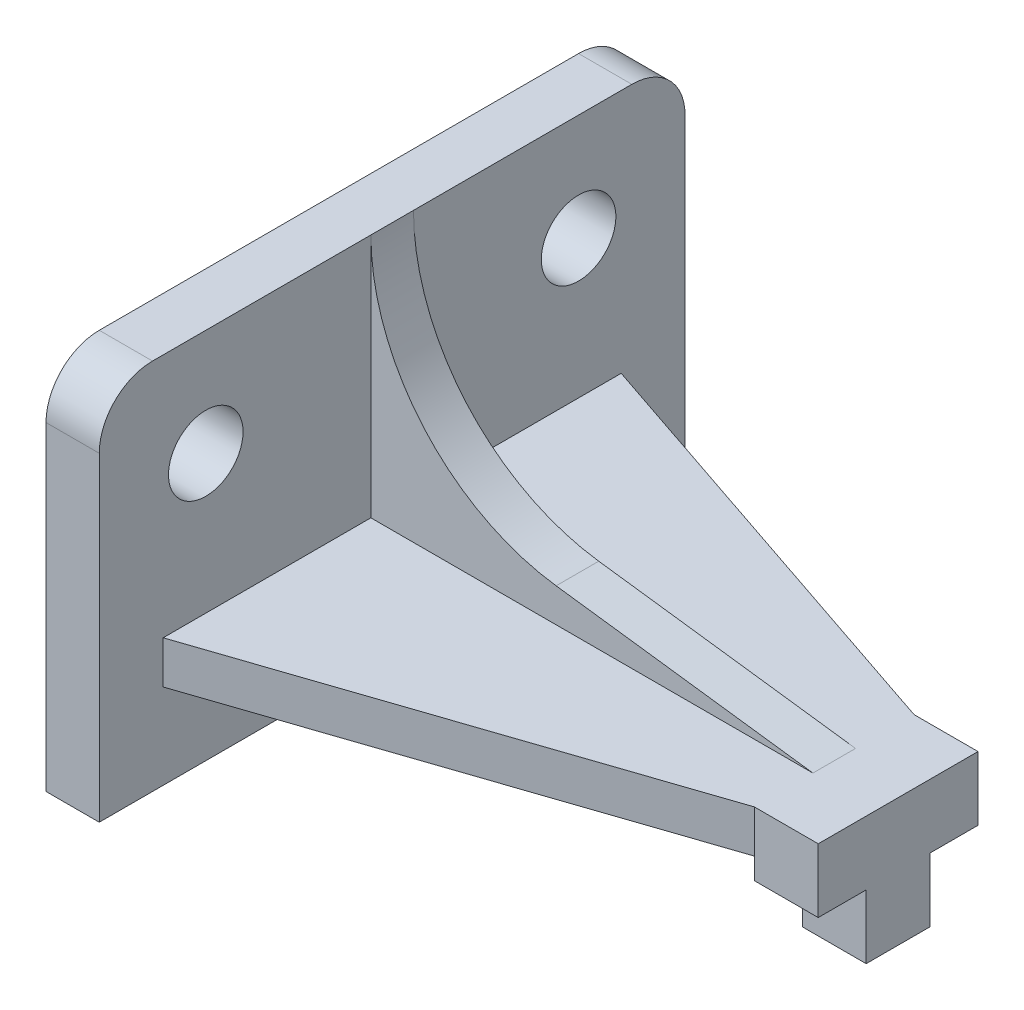
ISO-10303-21;
HEADER;
FILE_DESCRIPTION(('STEP AP214'),'2;1');
FILE_NAME('part.step','',(''),(''),'','','');
FILE_SCHEMA(('AUTOMOTIVE_DESIGN { 1 0 10303 214 1 1 1 1 }'));
ENDSEC;
DATA;
#1=APPLICATION_CONTEXT('core data for automotive mechanical design processes');
#2=APPLICATION_PROTOCOL_DEFINITION('international standard','automotive_design',2000,#1);
#3=PRODUCT_CONTEXT('',#1,'mechanical');
#4=PRODUCT('Part','Part','',(#3));
#5=PRODUCT_RELATED_PRODUCT_CATEGORY('part','',(#4));
#6=PRODUCT_DEFINITION_FORMATION('','',#4);
#7=PRODUCT_DEFINITION_CONTEXT('part definition',#1,'design');
#8=PRODUCT_DEFINITION('design','',#6,#7);
#9=PRODUCT_DEFINITION_SHAPE('','',#8);
#10=(LENGTH_UNIT() NAMED_UNIT(*) SI_UNIT(.MILLI.,.METRE.));
#11=(NAMED_UNIT(*) PLANE_ANGLE_UNIT() SI_UNIT($,.RADIAN.));
#12=(NAMED_UNIT(*) SI_UNIT($,.STERADIAN.) SOLID_ANGLE_UNIT());
#13=UNCERTAINTY_MEASURE_WITH_UNIT(LENGTH_MEASURE(1.E-05),#10,'distance_accuracy_value','');
#14=(GEOMETRIC_REPRESENTATION_CONTEXT(3) GLOBAL_UNCERTAINTY_ASSIGNED_CONTEXT((#13)) GLOBAL_UNIT_ASSIGNED_CONTEXT((#10,
#11,#12)) REPRESENTATION_CONTEXT('',''));
#15=CARTESIAN_POINT('',(0.,0.,0.));
#16=DIRECTION('',(0.,0.,1.));
#17=DIRECTION('',(1.,0.,0.));
#18=AXIS2_PLACEMENT_3D('',#15,#16,#17);
#19=CARTESIAN_POINT('',(93.,0.,0.));
#20=DIRECTION('',(-1.,0.,0.));
#21=DIRECTION('',(0.,0.,1.));
#22=AXIS2_PLACEMENT_3D('',#19,#20,#21);
#23=PLANE('',#22);
#24=DIRECTION('',(0.,1.,0.));
#25=VECTOR('',#24,1.);
#26=CARTESIAN_POINT('',(93.,-23.,15.));
#27=LINE('',#26,#25);
#28=CARTESIAN_POINT('',(93.,-23.,15.));
#29=VERTEX_POINT('',#28);
#30=CARTESIAN_POINT('',(93.,-19.,15.));
#31=VERTEX_POINT('',#30);
#32=EDGE_CURVE('E222',#29,#31,#27,.T.);
#33=ORIENTED_EDGE('',*,*,#32,.T.);
#34=DIRECTION('',(0.,0.,-1.));
#35=VECTOR('',#34,1.);
#36=CARTESIAN_POINT('',(93.,-19.,4.));
#37=LINE('',#36,#35);
#38=CARTESIAN_POINT('',(93.,-19.,-15.));
#39=VERTEX_POINT('',#38);
#40=EDGE_CURVE('E197',#31,#39,#37,.T.);
#41=ORIENTED_EDGE('',*,*,#40,.T.);
#42=DIRECTION('',(0.,-1.,0.));
#43=VECTOR('',#42,1.);
#44=CARTESIAN_POINT('',(93.,-11.,-15.));
#45=LINE('',#44,#43);
#46=CARTESIAN_POINT('',(93.,-23.,-15.));
#47=VERTEX_POINT('',#46);
#48=EDGE_CURVE('E214',#39,#47,#45,.T.);
#49=ORIENTED_EDGE('',*,*,#48,.T.);
#50=DIRECTION('',(0.,0.,1.));
#51=VECTOR('',#50,1.);
#52=CARTESIAN_POINT('',(93.,-23.,-15.));
#53=LINE('',#52,#51);
#54=CARTESIAN_POINT('',(93.,-23.,-6.));
#55=VERTEX_POINT('',#54);
#56=EDGE_CURVE('E216',#47,#55,#53,.T.);
#57=ORIENTED_EDGE('',*,*,#56,.T.);
#58=DIRECTION('',(0.,-1.,0.));
#59=VECTOR('',#58,1.);
#60=CARTESIAN_POINT('',(93.,-23.,-6.));
#61=LINE('',#60,#59);
#62=CARTESIAN_POINT('',(93.,-35.,-6.));
#63=VERTEX_POINT('',#62);
#64=EDGE_CURVE('E220',#55,#63,#61,.T.);
#65=ORIENTED_EDGE('',*,*,#64,.T.);
#66=DIRECTION('',(0.,0.,1.));
#67=VECTOR('',#66,1.);
#68=CARTESIAN_POINT('',(93.,-35.,-6.));
#69=LINE('',#68,#67);
#70=CARTESIAN_POINT('',(93.,-35.,6.00000000000001));
#71=VERTEX_POINT('',#70);
#72=EDGE_CURVE('E254',#63,#71,#69,.T.);
#73=ORIENTED_EDGE('',*,*,#72,.T.);
#74=DIRECTION('',(0.,1.,0.));
#75=VECTOR('',#74,1.);
#76=CARTESIAN_POINT('',(93.,-35.,6.00000000000001));
#77=LINE('',#76,#75);
#78=CARTESIAN_POINT('',(93.,-23.,6.00000000000001));
#79=VERTEX_POINT('',#78);
#80=EDGE_CURVE('E678',#71,#79,#77,.T.);
#81=ORIENTED_EDGE('',*,*,#80,.T.);
#82=DIRECTION('',(0.,0.,1.));
#83=VECTOR('',#82,1.);
#84=CARTESIAN_POINT('',(93.,-23.,6.00000000000001));
#85=LINE('',#84,#83);
#86=EDGE_CURVE('E680',#79,#29,#85,.T.);
#87=ORIENTED_EDGE('',*,*,#86,.T.);
#88=EDGE_LOOP('',(#33,#41,#49,#57,#65,#73,#81,#87));
#89=FACE_BOUND('',#88,.T.);
#90=ADVANCED_FACE('F45',(#89),#23,.T.);
#91=CARTESIAN_POINT('',(10.,25.,45.));
#92=DIRECTION('',(1.,0.,0.));
#93=DIRECTION('',(0.,0.,-1.));
#94=AXIS2_PLACEMENT_3D('',#91,#92,#93);
#95=PLANE('',#94);
#96=DIRECTION('',(0.,0.,1.));
#97=VECTOR('',#96,1.);
#98=CARTESIAN_POINT('',(9.99999999999999,-11.,4.));
#99=LINE('',#98,#97);
#100=CARTESIAN_POINT('',(9.99999999999999,-11.,-43.));
#101=VERTEX_POINT('',#100);
#102=CARTESIAN_POINT('',(9.99999999999999,-11.,-4.));
#103=VERTEX_POINT('',#102);
#104=EDGE_CURVE('E426',#101,#103,#99,.T.);
#105=ORIENTED_EDGE('',*,*,#104,.F.);
#106=DIRECTION('',(0.,-1.,0.));
#107=VECTOR('',#106,1.);
#108=CARTESIAN_POINT('',(9.99999999999999,-11.,-43.));
#109=LINE('',#108,#107);
#110=CARTESIAN_POINT('',(9.99999999999999,-19.,-43.));
#111=VERTEX_POINT('',#110);
#112=EDGE_CURVE('E192',#101,#111,#109,.T.);
#113=ORIENTED_EDGE('',*,*,#112,.T.);
#114=DIRECTION('',(0.,0.,1.));
#115=VECTOR('',#114,1.);
#116=CARTESIAN_POINT('',(9.99999999999999,-19.,4.));
#117=LINE('',#116,#115);
#118=CARTESIAN_POINT('',(9.99999999999998,-19.,43.));
#119=VERTEX_POINT('',#118);
#120=EDGE_CURVE('E650',#111,#119,#117,.T.);
#121=ORIENTED_EDGE('',*,*,#120,.T.);
#122=DIRECTION('',(0.,-1.,0.));
#123=VECTOR('',#122,1.);
#124=CARTESIAN_POINT('',(9.99999999999998,-11.,43.));
#125=LINE('',#124,#123);
#126=CARTESIAN_POINT('',(9.99999999999998,-11.,43.));
#127=VERTEX_POINT('',#126);
#128=EDGE_CURVE('E665',#127,#119,#125,.T.);
#129=ORIENTED_EDGE('',*,*,#128,.F.);
#130=CARTESIAN_POINT('',(9.99999999999999,-11.,4.));
#131=VERTEX_POINT('',#130);
#132=EDGE_CURVE('E196',#131,#127,#99,.T.);
#133=ORIENTED_EDGE('',*,*,#132,.F.);
#134=DIRECTION('',(0.,-1.,0.));
#135=VECTOR('',#134,1.);
#136=CARTESIAN_POINT('',(10.,35.,4.));
#137=LINE('',#136,#135);
#138=CARTESIAN_POINT('',(10.,35.,4.));
#139=VERTEX_POINT('',#138);
#140=EDGE_CURVE('E284',#139,#131,#137,.T.);
#141=ORIENTED_EDGE('',*,*,#140,.F.);
#142=DIRECTION('',(0.,0.,1.));
#143=VECTOR('',#142,1.);
#144=CARTESIAN_POINT('',(10.,35.,44.9999999999999));
#145=LINE('',#144,#143);
#146=CARTESIAN_POINT('',(10.,35.,44.9999999999999));
#147=VERTEX_POINT('',#146);
#148=EDGE_CURVE('E336',#139,#147,#145,.T.);
#149=ORIENTED_EDGE('',*,*,#148,.T.);
#150=CARTESIAN_POINT('',(10.,25.,45.));
#151=DIRECTION('',(1.,0.,0.));
#152=DIRECTION('',(0.,0.,-1.));
#153=AXIS2_PLACEMENT_3D('',#150,#151,#152);
#154=CIRCLE('',#153,10.);
#155=CARTESIAN_POINT('',(10.,24.9999999999999,55.));
#156=VERTEX_POINT('',#155);
#157=EDGE_CURVE('E340',#147,#156,#154,.T.);
#158=ORIENTED_EDGE('',*,*,#157,.T.);
#159=DIRECTION('',(0.,-1.,0.));
#160=VECTOR('',#159,1.);
#161=CARTESIAN_POINT('',(10.,24.9999999999999,55.));
#162=LINE('',#161,#160);
#163=CARTESIAN_POINT('',(10.,-35.,55.));
#164=VERTEX_POINT('',#163);
#165=EDGE_CURVE('E343',#156,#164,#162,.T.);
#166=ORIENTED_EDGE('',*,*,#165,.T.);
#167=DIRECTION('',(0.,0.,-1.));
#168=VECTOR('',#167,1.);
#169=CARTESIAN_POINT('',(10.,-35.,55.));
#170=LINE('',#169,#168);
#171=CARTESIAN_POINT('',(10.,-35.,-55.));
#172=VERTEX_POINT('',#171);
#173=EDGE_CURVE('E346',#164,#172,#170,.T.);
#174=ORIENTED_EDGE('',*,*,#173,.T.);
#175=DIRECTION('',(0.,1.,0.));
#176=VECTOR('',#175,1.);
#177=CARTESIAN_POINT('',(10.,24.9999999999999,-55.));
#178=LINE('',#177,#176);
#179=CARTESIAN_POINT('',(10.,24.9999999999999,-55.));
#180=VERTEX_POINT('',#179);
#181=EDGE_CURVE('E328',#172,#180,#178,.T.);
#182=ORIENTED_EDGE('',*,*,#181,.T.);
#183=CARTESIAN_POINT('',(10.,25.,-45.));
#184=DIRECTION('',(1.,0.,0.));
#185=DIRECTION('',(0.,0.,1.));
#186=AXIS2_PLACEMENT_3D('',#183,#184,#185);
#187=CIRCLE('',#186,10.);
#188=CARTESIAN_POINT('',(10.,35.,-44.9999999999999));
#189=VERTEX_POINT('',#188);
#190=EDGE_CURVE('E332',#180,#189,#187,.T.);
#191=ORIENTED_EDGE('',*,*,#190,.T.);
#192=CARTESIAN_POINT('',(10.,35.,-4.));
#193=VERTEX_POINT('',#192);
#194=EDGE_CURVE('E337',#189,#193,#145,.T.);
#195=ORIENTED_EDGE('',*,*,#194,.T.);
#196=DIRECTION('',(0.,-1.,0.));
#197=VECTOR('',#196,1.);
#198=CARTESIAN_POINT('',(10.,35.,-4.));
#199=LINE('',#198,#197);
#200=EDGE_CURVE('E296',#193,#103,#199,.T.);
#201=ORIENTED_EDGE('',*,*,#200,.T.);
#202=EDGE_LOOP('',(#105,#113,#121,#129,#133,#141,#149,#158,#166,#174,#182,#191,#195,#201));
#203=FACE_BOUND('',#202,.T.);
#204=CARTESIAN_POINT('',(10.,15.,35.));
#205=DIRECTION('',(1.,0.,0.));
#206=DIRECTION('',(0.,0.,-1.));
#207=AXIS2_PLACEMENT_3D('',#204,#205,#206);
#208=CIRCLE('',#207,7.);
#209=CARTESIAN_POINT('',(10.,15.,28.));
#210=VERTEX_POINT('',#209);
#211=EDGE_CURVE('E320',#210,#210,#208,.T.);
#212=ORIENTED_EDGE('',*,*,#211,.F.);
#213=EDGE_LOOP('',(#212));
#214=FACE_BOUND('',#213,.T.);
#215=CARTESIAN_POINT('',(10.,15.,-35.));
#216=DIRECTION('',(1.,0.,0.));
#217=DIRECTION('',(0.,0.,1.));
#218=AXIS2_PLACEMENT_3D('',#215,#216,#217);
#219=CIRCLE('',#218,7.);
#220=CARTESIAN_POINT('',(10.,15.,-28.));
#221=VERTEX_POINT('',#220);
#222=EDGE_CURVE('E312',#221,#221,#219,.T.);
#223=ORIENTED_EDGE('',*,*,#222,.F.);
#224=EDGE_LOOP('',(#223));
#225=FACE_BOUND('',#224,.T.);
#226=ADVANCED_FACE('F405',(#203,#214,#225),#95,.T.);
#227=CARTESIAN_POINT('',(0.,25.,45.));
#228=DIRECTION('',(1.,0.,0.));
#229=DIRECTION('',(0.,0.,-1.));
#230=AXIS2_PLACEMENT_3D('',#227,#228,#229);
#231=PLANE('',#230);
#232=DIRECTION('',(0.,1.,0.));
#233=VECTOR('',#232,1.);
#234=CARTESIAN_POINT('',(0.,24.9999999999999,-55.));
#235=LINE('',#234,#233);
#236=CARTESIAN_POINT('',(0.,-35.,-55.));
#237=VERTEX_POINT('',#236);
#238=CARTESIAN_POINT('',(0.,24.9999999999999,-55.));
#239=VERTEX_POINT('',#238);
#240=EDGE_CURVE('E324',#237,#239,#235,.T.);
#241=ORIENTED_EDGE('',*,*,#240,.F.);
#242=DIRECTION('',(0.,0.,-1.));
#243=VECTOR('',#242,1.);
#244=CARTESIAN_POINT('',(0.,-35.,55.));
#245=LINE('',#244,#243);
#246=CARTESIAN_POINT('',(0.,-35.,55.));
#247=VERTEX_POINT('',#246);
#248=EDGE_CURVE('E333',#247,#237,#245,.T.);
#249=ORIENTED_EDGE('',*,*,#248,.F.);
#250=DIRECTION('',(0.,-1.,0.));
#251=VECTOR('',#250,1.);
#252=CARTESIAN_POINT('',(0.,24.9999999999999,55.));
#253=LINE('',#252,#251);
#254=CARTESIAN_POINT('',(0.,24.9999999999999,55.));
#255=VERTEX_POINT('',#254);
#256=EDGE_CURVE('E362',#255,#247,#253,.T.);
#257=ORIENTED_EDGE('',*,*,#256,.F.);
#258=CARTESIAN_POINT('',(0.,25.,45.));
#259=DIRECTION('',(1.,0.,0.));
#260=DIRECTION('',(0.,0.,-1.));
#261=AXIS2_PLACEMENT_3D('',#258,#259,#260);
#262=CIRCLE('',#261,10.);
#263=CARTESIAN_POINT('',(0.,35.,44.9999999999999));
#264=VERTEX_POINT('',#263);
#265=EDGE_CURVE('E359',#264,#255,#262,.T.);
#266=ORIENTED_EDGE('',*,*,#265,.F.);
#267=DIRECTION('',(0.,0.,1.));
#268=VECTOR('',#267,1.);
#269=CARTESIAN_POINT('',(0.,35.,44.9999999999999));
#270=LINE('',#269,#268);
#271=CARTESIAN_POINT('',(0.,35.,-44.9999999999999));
#272=VERTEX_POINT('',#271);
#273=EDGE_CURVE('E356',#272,#264,#270,.T.);
#274=ORIENTED_EDGE('',*,*,#273,.F.);
#275=CARTESIAN_POINT('',(0.,25.,-45.));
#276=DIRECTION('',(1.,0.,0.));
#277=DIRECTION('',(0.,0.,1.));
#278=AXIS2_PLACEMENT_3D('',#275,#276,#277);
#279=CIRCLE('',#278,10.);
#280=EDGE_CURVE('E353',#239,#272,#279,.T.);
#281=ORIENTED_EDGE('',*,*,#280,.F.);
#282=EDGE_LOOP('',(#241,#249,#257,#266,#274,#281));
#283=FACE_BOUND('',#282,.T.);
#284=CARTESIAN_POINT('',(0.,15.,35.));
#285=DIRECTION('',(1.,0.,0.));
#286=DIRECTION('',(0.,0.,-1.));
#287=AXIS2_PLACEMENT_3D('',#284,#285,#286);
#288=CIRCLE('',#287,7.);
#289=CARTESIAN_POINT('',(0.,15.,28.));
#290=VERTEX_POINT('',#289);
#291=EDGE_CURVE('E316',#290,#290,#288,.T.);
#292=ORIENTED_EDGE('',*,*,#291,.T.);
#293=EDGE_LOOP('',(#292));
#294=FACE_BOUND('',#293,.T.);
#295=CARTESIAN_POINT('',(0.,15.,-35.));
#296=DIRECTION('',(1.,0.,0.));
#297=DIRECTION('',(0.,0.,1.));
#298=AXIS2_PLACEMENT_3D('',#295,#296,#297);
#299=CIRCLE('',#298,7.);
#300=CARTESIAN_POINT('',(0.,15.,-28.));
#301=VERTEX_POINT('',#300);
#302=EDGE_CURVE('E311',#301,#301,#299,.T.);
#303=ORIENTED_EDGE('',*,*,#302,.T.);
#304=EDGE_LOOP('',(#303));
#305=FACE_BOUND('',#304,.T.);
#306=ADVANCED_FACE('F391',(#283,#294,#305),#231,.F.);
#307=CARTESIAN_POINT('',(10.,24.9999999999999,-55.));
#308=DIRECTION('',(0.,0.,1.));
#309=DIRECTION('',(0.,-1.,0.));
#310=AXIS2_PLACEMENT_3D('',#307,#308,#309);
#311=PLANE('',#310);
#312=ORIENTED_EDGE('',*,*,#240,.T.);
#313=DIRECTION('',(-1.,0.,0.));
#314=VECTOR('',#313,1.);
#315=CARTESIAN_POINT('',(10.,24.9999999999999,-55.));
#316=LINE('',#315,#314);
#317=EDGE_CURVE('E11',#180,#239,#316,.T.);
#318=ORIENTED_EDGE('',*,*,#317,.F.);
#319=ORIENTED_EDGE('',*,*,#181,.F.);
#320=DIRECTION('',(-1.,0.,0.));
#321=VECTOR('',#320,1.);
#322=CARTESIAN_POINT('',(10.,-35.,-55.));
#323=LINE('',#322,#321);
#324=EDGE_CURVE('E349',#172,#237,#323,.T.);
#325=ORIENTED_EDGE('',*,*,#324,.T.);
#326=EDGE_LOOP('',(#312,#318,#319,#325));
#327=FACE_BOUND('',#326,.T.);
#328=ADVANCED_FACE('F47',(#327),#311,.F.);
#329=CARTESIAN_POINT('',(10.,25.,-45.));
#330=DIRECTION('',(-1.,0.,0.));
#331=DIRECTION('',(0.,0.,1.));
#332=AXIS2_PLACEMENT_3D('',#329,#330,#331);
#333=CYLINDRICAL_SURFACE('',#332,10.);
#334=ORIENTED_EDGE('',*,*,#280,.T.);
#335=DIRECTION('',(-1.,0.,0.));
#336=VECTOR('',#335,1.);
#337=CARTESIAN_POINT('',(10.,35.,-44.9999999999999));
#338=LINE('',#337,#336);
#339=EDGE_CURVE('E54',#189,#272,#338,.T.);
#340=ORIENTED_EDGE('',*,*,#339,.F.);
#341=ORIENTED_EDGE('',*,*,#190,.F.);
#342=ORIENTED_EDGE('',*,*,#317,.T.);
#343=EDGE_LOOP('',(#334,#340,#341,#342));
#344=FACE_BOUND('',#343,.T.);
#345=ADVANCED_FACE('F429',(#344),#333,.T.);
#346=CARTESIAN_POINT('',(10.,35.,44.9999999999999));
#347=DIRECTION('',(0.,-1.,0.));
#348=DIRECTION('',(0.,0.,-1.));
#349=AXIS2_PLACEMENT_3D('',#346,#347,#348);
#350=PLANE('',#349);
#351=ORIENTED_EDGE('',*,*,#273,.T.);
#352=DIRECTION('',(-1.,0.,0.));
#353=VECTOR('',#352,1.);
#354=CARTESIAN_POINT('',(10.,35.,44.9999999999999));
#355=LINE('',#354,#353);
#356=EDGE_CURVE('E378',#147,#264,#355,.T.);
#357=ORIENTED_EDGE('',*,*,#356,.F.);
#358=ORIENTED_EDGE('',*,*,#148,.F.);
#359=DIRECTION('',(0.,0.,-1.));
#360=VECTOR('',#359,1.);
#361=CARTESIAN_POINT('',(10.,35.,4.));
#362=LINE('',#361,#360);
#363=EDGE_CURVE('E69',#139,#193,#362,.T.);
#364=ORIENTED_EDGE('',*,*,#363,.T.);
#365=ORIENTED_EDGE('',*,*,#194,.F.);
#366=ORIENTED_EDGE('',*,*,#339,.T.);
#367=EDGE_LOOP('',(#351,#357,#358,#364,#365,#366));
#368=FACE_BOUND('',#367,.T.);
#369=ADVANCED_FACE('F385',(#368),#350,.F.);
#370=CARTESIAN_POINT('',(10.,25.,45.));
#371=DIRECTION('',(-1.,0.,0.));
#372=DIRECTION('',(0.,0.,1.));
#373=AXIS2_PLACEMENT_3D('',#370,#371,#372);
#374=CYLINDRICAL_SURFACE('',#373,10.);
#375=ORIENTED_EDGE('',*,*,#265,.T.);
#376=DIRECTION('',(-1.,0.,0.));
#377=VECTOR('',#376,1.);
#378=CARTESIAN_POINT('',(10.,24.9999999999999,55.));
#379=LINE('',#378,#377);
#380=EDGE_CURVE('E374',#156,#255,#379,.T.);
#381=ORIENTED_EDGE('',*,*,#380,.F.);
#382=ORIENTED_EDGE('',*,*,#157,.F.);
#383=ORIENTED_EDGE('',*,*,#356,.T.);
#384=EDGE_LOOP('',(#375,#381,#382,#383));
#385=FACE_BOUND('',#384,.T.);
#386=ADVANCED_FACE('F397',(#385),#374,.T.);
#387=CARTESIAN_POINT('',(10.,24.9999999999999,55.));
#388=DIRECTION('',(0.,0.,-1.));
#389=DIRECTION('',(0.,1.,0.));
#390=AXIS2_PLACEMENT_3D('',#387,#388,#389);
#391=PLANE('',#390);
#392=ORIENTED_EDGE('',*,*,#256,.T.);
#393=DIRECTION('',(-1.,0.,0.));
#394=VECTOR('',#393,1.);
#395=CARTESIAN_POINT('',(10.,-35.,55.));
#396=LINE('',#395,#394);
#397=EDGE_CURVE('E370',#164,#247,#396,.T.);
#398=ORIENTED_EDGE('',*,*,#397,.F.);
#399=ORIENTED_EDGE('',*,*,#165,.F.);
#400=ORIENTED_EDGE('',*,*,#380,.T.);
#401=EDGE_LOOP('',(#392,#398,#399,#400));
#402=FACE_BOUND('',#401,.T.);
#403=ADVANCED_FACE('F401',(#402),#391,.F.);
#404=CARTESIAN_POINT('',(10.,-35.,55.));
#405=DIRECTION('',(0.,1.,0.));
#406=DIRECTION('',(0.,0.,1.));
#407=AXIS2_PLACEMENT_3D('',#404,#405,#406);
#408=PLANE('',#407);
#409=ORIENTED_EDGE('',*,*,#248,.T.);
#410=ORIENTED_EDGE('',*,*,#324,.F.);
#411=ORIENTED_EDGE('',*,*,#173,.F.);
#412=ORIENTED_EDGE('',*,*,#397,.T.);
#413=EDGE_LOOP('',(#409,#410,#411,#412));
#414=FACE_BOUND('',#413,.T.);
#415=ADVANCED_FACE('F432',(#414),#408,.F.);
#416=CARTESIAN_POINT('',(10.,15.,35.));
#417=DIRECTION('',(-1.,0.,0.));
#418=DIRECTION('',(0.,0.,1.));
#419=AXIS2_PLACEMENT_3D('',#416,#417,#418);
#420=CYLINDRICAL_SURFACE('',#419,7.);
#421=ORIENTED_EDGE('',*,*,#211,.T.);
#422=EDGE_LOOP('',(#421));
#423=FACE_BOUND('',#422,.T.);
#424=ORIENTED_EDGE('',*,*,#291,.F.);
#425=EDGE_LOOP('',(#424));
#426=FACE_BOUND('',#425,.T.);
#427=ADVANCED_FACE('F434',(#423,#426),#420,.F.);
#428=CARTESIAN_POINT('',(10.,15.,-35.));
#429=DIRECTION('',(-1.,0.,0.));
#430=DIRECTION('',(0.,0.,1.));
#431=AXIS2_PLACEMENT_3D('',#428,#429,#430);
#432=CYLINDRICAL_SURFACE('',#431,7.);
#433=ORIENTED_EDGE('',*,*,#222,.T.);
#434=EDGE_LOOP('',(#433));
#435=FACE_BOUND('',#434,.T.);
#436=ORIENTED_EDGE('',*,*,#302,.F.);
#437=EDGE_LOOP('',(#436));
#438=FACE_BOUND('',#437,.T.);
#439=ADVANCED_FACE('F440',(#435,#438),#432,.F.);
#440=CARTESIAN_POINT('',(50.,35.,4.));
#441=DIRECTION('',(0.,0.,-1.));
#442=DIRECTION('',(-1.,0.,0.));
#443=AXIS2_PLACEMENT_3D('',#440,#441,#442);
#444=CYLINDRICAL_SURFACE('',#443,40.);
#445=CARTESIAN_POINT('',(50.,35.,-4.));
#446=DIRECTION('',(0.,0.,-1.));
#447=DIRECTION('',(1.,0.,0.));
#448=AXIS2_PLACEMENT_3D('',#445,#446,#447);
#449=CIRCLE('',#448,40.);
#450=CARTESIAN_POINT('',(44.7839775989411,-4.65845572272894,-4.));
#451=VERTEX_POINT('',#450);
#452=EDGE_CURVE('E279',#451,#193,#449,.T.);
#453=ORIENTED_EDGE('',*,*,#452,.T.);
#454=ORIENTED_EDGE('',*,*,#363,.F.);
#455=CARTESIAN_POINT('',(50.,35.,4.));
#456=DIRECTION('',(0.,0.,-1.));
#457=DIRECTION('',(1.,0.,0.));
#458=AXIS2_PLACEMENT_3D('',#455,#456,#457);
#459=CIRCLE('',#458,40.);
#460=CARTESIAN_POINT('',(44.7839775989411,-4.65845572272894,4.));
#461=VERTEX_POINT('',#460);
#462=EDGE_CURVE('E280',#461,#139,#459,.T.);
#463=ORIENTED_EDGE('',*,*,#462,.F.);
#464=DIRECTION('',(0.,0.,-1.));
#465=VECTOR('',#464,1.);
#466=CARTESIAN_POINT('',(44.7839775989411,-4.65845572272894,4.));
#467=LINE('',#466,#465);
#468=EDGE_CURVE('E292',#461,#451,#467,.T.);
#469=ORIENTED_EDGE('',*,*,#468,.T.);
#470=EDGE_LOOP('',(#453,#454,#463,#469));
#471=FACE_BOUND('',#470,.T.);
#472=ADVANCED_FACE('F418',(#471),#444,.F.);
#473=CARTESIAN_POINT('',(44.7839775989411,-4.65845572272894,4.));
#474=DIRECTION('',(-0.130400560026472,-0.991461393068223,0.));
#475=DIRECTION('',(0.991461393068224,-0.130400560026472,0.));
#476=AXIS2_PLACEMENT_3D('',#473,#474,#475);
#477=PLANE('',#476);
#478=DIRECTION('',(-0.991461393068224,0.130400560026472,0.));
#479=VECTOR('',#478,1.);
#480=CARTESIAN_POINT('',(44.7839775989411,-4.65845572272894,-4.));
#481=LINE('',#480,#479);
#482=CARTESIAN_POINT('',(93.,-11.,-4.));
#483=VERTEX_POINT('',#482);
#484=EDGE_CURVE('E285',#483,#451,#481,.T.);
#485=ORIENTED_EDGE('',*,*,#484,.T.);
#486=ORIENTED_EDGE('',*,*,#468,.F.);
#487=DIRECTION('',(-0.991461393068224,0.130400560026472,0.));
#488=VECTOR('',#487,1.);
#489=CARTESIAN_POINT('',(44.7839775989411,-4.65845572272894,4.));
#490=LINE('',#489,#488);
#491=CARTESIAN_POINT('',(93.,-11.,4.));
#492=VERTEX_POINT('',#491);
#493=EDGE_CURVE('E289',#492,#461,#490,.T.);
#494=ORIENTED_EDGE('',*,*,#493,.F.);
#495=DIRECTION('',(0.,0.,-1.));
#496=VECTOR('',#495,1.);
#497=CARTESIAN_POINT('',(93.,-11.,4.));
#498=LINE('',#497,#496);
#499=EDGE_CURVE('E305',#492,#483,#498,.T.);
#500=ORIENTED_EDGE('',*,*,#499,.T.);
#501=EDGE_LOOP('',(#485,#486,#494,#500));
#502=FACE_BOUND('',#501,.T.);
#503=ADVANCED_FACE('F490',(#502),#477,.F.);
#504=CARTESIAN_POINT('',(50.,35.,4.));
#505=DIRECTION('',(0.,0.,1.));
#506=DIRECTION('',(1.,0.,0.));
#507=AXIS2_PLACEMENT_3D('',#504,#505,#506);
#508=PLANE('',#507);
#509=DIRECTION('',(-1.,0.,0.));
#510=VECTOR('',#509,1.);
#511=CARTESIAN_POINT('',(50.,-11.,4.));
#512=LINE('',#511,#510);
#513=EDGE_CURVE('E234',#492,#131,#512,.T.);
#514=ORIENTED_EDGE('',*,*,#513,.F.);
#515=ORIENTED_EDGE('',*,*,#493,.T.);
#516=ORIENTED_EDGE('',*,*,#462,.T.);
#517=ORIENTED_EDGE('',*,*,#140,.T.);
#518=EDGE_LOOP('',(#514,#515,#516,#517));
#519=FACE_BOUND('',#518,.T.);
#520=ADVANCED_FACE('F414',(#519),#508,.T.);
#521=CARTESIAN_POINT('',(50.,35.,-4.));
#522=DIRECTION('',(0.,0.,1.));
#523=DIRECTION('',(1.,0.,0.));
#524=AXIS2_PLACEMENT_3D('',#521,#522,#523);
#525=PLANE('',#524);
#526=ORIENTED_EDGE('',*,*,#484,.F.);
#527=DIRECTION('',(-1.,0.,0.));
#528=VECTOR('',#527,1.);
#529=CARTESIAN_POINT('',(50.,-11.,-4.));
#530=LINE('',#529,#528);
#531=EDGE_CURVE('E425',#483,#103,#530,.T.);
#532=ORIENTED_EDGE('',*,*,#531,.T.);
#533=ORIENTED_EDGE('',*,*,#200,.F.);
#534=ORIENTED_EDGE('',*,*,#452,.F.);
#535=EDGE_LOOP('',(#526,#532,#533,#534));
#536=FACE_BOUND('',#535,.T.);
#537=ADVANCED_FACE('F423',(#536),#525,.F.);
#538=CARTESIAN_POINT('',(93.,-35.,-6.));
#539=DIRECTION('',(0.,1.,0.));
#540=DIRECTION('',(0.,0.,1.));
#541=AXIS2_PLACEMENT_3D('',#538,#539,#540);
#542=PLANE('',#541);
#543=DIRECTION('',(0.,0.,1.));
#544=VECTOR('',#543,1.);
#545=CARTESIAN_POINT('',(105.,-35.,-6.));
#546=LINE('',#545,#544);
#547=CARTESIAN_POINT('',(105.,-35.,-6.));
#548=VERTEX_POINT('',#547);
#549=CARTESIAN_POINT('',(105.,-35.,6.00000000000001));
#550=VERTEX_POINT('',#549);
#551=EDGE_CURVE('E229',#548,#550,#546,.T.);
#552=ORIENTED_EDGE('',*,*,#551,.T.);
#553=DIRECTION('',(1.,0.,0.));
#554=VECTOR('',#553,1.);
#555=CARTESIAN_POINT('',(93.,-35.,6.00000000000001));
#556=LINE('',#555,#554);
#557=EDGE_CURVE('E275',#71,#550,#556,.T.);
#558=ORIENTED_EDGE('',*,*,#557,.F.);
#559=ORIENTED_EDGE('',*,*,#72,.F.);
#560=DIRECTION('',(1.,0.,0.));
#561=VECTOR('',#560,1.);
#562=CARTESIAN_POINT('',(93.,-35.,-6.));
#563=LINE('',#562,#561);
#564=EDGE_CURVE('E228',#63,#548,#563,.T.);
#565=ORIENTED_EDGE('',*,*,#564,.T.);
#566=EDGE_LOOP('',(#552,#558,#559,#565));
#567=FACE_BOUND('',#566,.T.);
#568=ADVANCED_FACE('F483',(#567),#542,.F.);
#569=CARTESIAN_POINT('',(93.,-35.,6.00000000000001));
#570=DIRECTION('',(0.,0.,-1.));
#571=DIRECTION('',(-1.,0.,0.));
#572=AXIS2_PLACEMENT_3D('',#569,#570,#571);
#573=PLANE('',#572);
#574=DIRECTION('',(0.,1.,0.));
#575=VECTOR('',#574,1.);
#576=CARTESIAN_POINT('',(105.,-35.,6.00000000000001));
#577=LINE('',#576,#575);
#578=CARTESIAN_POINT('',(105.,-23.,6.00000000000001));
#579=VERTEX_POINT('',#578);
#580=EDGE_CURVE('E233',#550,#579,#577,.T.);
#581=ORIENTED_EDGE('',*,*,#580,.T.);
#582=DIRECTION('',(1.,0.,0.));
#583=VECTOR('',#582,1.);
#584=CARTESIAN_POINT('',(93.,-23.,6.00000000000001));
#585=LINE('',#584,#583);
#586=EDGE_CURVE('E271',#79,#579,#585,.T.);
#587=ORIENTED_EDGE('',*,*,#586,.F.);
#588=ORIENTED_EDGE('',*,*,#80,.F.);
#589=ORIENTED_EDGE('',*,*,#557,.T.);
#590=EDGE_LOOP('',(#581,#587,#588,#589));
#591=FACE_BOUND('',#590,.T.);
#592=ADVANCED_FACE('F479',(#591),#573,.F.);
#593=CARTESIAN_POINT('',(93.,-23.,6.00000000000001));
#594=DIRECTION('',(0.,1.,0.));
#595=DIRECTION('',(0.,0.,1.));
#596=AXIS2_PLACEMENT_3D('',#593,#594,#595);
#597=PLANE('',#596);
#598=DIRECTION('',(0.,0.,1.));
#599=VECTOR('',#598,1.);
#600=CARTESIAN_POINT('',(105.,-23.,6.00000000000001));
#601=LINE('',#600,#599);
#602=CARTESIAN_POINT('',(105.,-23.,15.));
#603=VERTEX_POINT('',#602);
#604=EDGE_CURVE('E237',#579,#603,#601,.T.);
#605=ORIENTED_EDGE('',*,*,#604,.T.);
#606=DIRECTION('',(1.,0.,0.));
#607=VECTOR('',#606,1.);
#608=CARTESIAN_POINT('',(93.,-23.,15.));
#609=LINE('',#608,#607);
#610=EDGE_CURVE('E267',#29,#603,#609,.T.);
#611=ORIENTED_EDGE('',*,*,#610,.F.);
#612=ORIENTED_EDGE('',*,*,#86,.F.);
#613=ORIENTED_EDGE('',*,*,#586,.T.);
#614=EDGE_LOOP('',(#605,#611,#612,#613));
#615=FACE_BOUND('',#614,.T.);
#616=ADVANCED_FACE('F475',(#615),#597,.F.);
#617=CARTESIAN_POINT('',(93.,-23.,15.));
#618=DIRECTION('',(0.,0.,-1.));
#619=DIRECTION('',(0.,1.,0.));
#620=AXIS2_PLACEMENT_3D('',#617,#618,#619);
#621=PLANE('',#620);
#622=DIRECTION('',(0.,1.,0.));
#623=VECTOR('',#622,1.);
#624=CARTESIAN_POINT('',(105.,-23.,15.));
#625=LINE('',#624,#623);
#626=CARTESIAN_POINT('',(105.,-11.,15.));
#627=VERTEX_POINT('',#626);
#628=EDGE_CURVE('E240',#603,#627,#625,.T.);
#629=ORIENTED_EDGE('',*,*,#628,.T.);
#630=DIRECTION('',(1.,0.,0.));
#631=VECTOR('',#630,1.);
#632=CARTESIAN_POINT('',(93.,-11.,15.));
#633=LINE('',#632,#631);
#634=CARTESIAN_POINT('',(93.,-11.,15.));
#635=VERTEX_POINT('',#634);
#636=EDGE_CURVE('E208',#635,#627,#633,.T.);
#637=ORIENTED_EDGE('',*,*,#636,.F.);
#638=DIRECTION('',(0.,-1.,0.));
#639=VECTOR('',#638,1.);
#640=CARTESIAN_POINT('',(93.,-11.,15.));
#641=LINE('',#640,#639);
#642=EDGE_CURVE('E661',#635,#31,#641,.T.);
#643=ORIENTED_EDGE('',*,*,#642,.T.);
#644=ORIENTED_EDGE('',*,*,#32,.F.);
#645=ORIENTED_EDGE('',*,*,#610,.T.);
#646=EDGE_LOOP('',(#629,#637,#643,#644,#645));
#647=FACE_BOUND('',#646,.T.);
#648=ADVANCED_FACE('F472',(#647),#621,.F.);
#649=CARTESIAN_POINT('',(93.,-11.,15.));
#650=DIRECTION('',(0.,-1.,0.));
#651=DIRECTION('',(0.,0.,-1.));
#652=AXIS2_PLACEMENT_3D('',#649,#650,#651);
#653=PLANE('',#652);
#654=DIRECTION('',(0.,0.,-1.));
#655=VECTOR('',#654,1.);
#656=CARTESIAN_POINT('',(105.,-11.,15.));
#657=LINE('',#656,#655);
#658=CARTESIAN_POINT('',(105.,-11.,-15.));
#659=VERTEX_POINT('',#658);
#660=EDGE_CURVE('E204',#627,#659,#657,.T.);
#661=ORIENTED_EDGE('',*,*,#660,.T.);
#662=DIRECTION('',(1.,0.,0.));
#663=VECTOR('',#662,1.);
#664=CARTESIAN_POINT('',(93.,-11.,-15.));
#665=LINE('',#664,#663);
#666=CARTESIAN_POINT('',(93.,-11.,-15.));
#667=VERTEX_POINT('',#666);
#668=EDGE_CURVE('E200',#667,#659,#665,.T.);
#669=ORIENTED_EDGE('',*,*,#668,.F.);
#670=DIRECTION('',(-0.947535507027608,0.,-0.319650532491241));
#671=VECTOR('',#670,1.);
#672=CARTESIAN_POINT('',(98.7547243581389,-11.,-13.0586472044833));
#673=LINE('',#672,#671);
#674=EDGE_CURVE('E188',#667,#101,#673,.T.);
#675=ORIENTED_EDGE('',*,*,#674,.T.);
#676=ORIENTED_EDGE('',*,*,#104,.T.);
#677=ORIENTED_EDGE('',*,*,#531,.F.);
#678=ORIENTED_EDGE('',*,*,#499,.F.);
#679=ORIENTED_EDGE('',*,*,#513,.T.);
#680=ORIENTED_EDGE('',*,*,#132,.T.);
#681=DIRECTION('',(0.947535507027608,0.,-0.319650532491241));
#682=VECTOR('',#681,1.);
#683=CARTESIAN_POINT('',(96.3316825231331,-11.,13.8760589078587));
#684=LINE('',#683,#682);
#685=EDGE_CURVE('E666',#127,#635,#684,.T.);
#686=ORIENTED_EDGE('',*,*,#685,.T.);
#687=ORIENTED_EDGE('',*,*,#636,.T.);
#688=EDGE_LOOP('',(#661,#669,#675,#676,#677,#678,#679,#680,#686,#687));
#689=FACE_BOUND('',#688,.T.);
#690=ADVANCED_FACE('F201',(#689),#653,.F.);
#691=CARTESIAN_POINT('',(93.,-11.,-15.));
#692=DIRECTION('',(0.,0.,1.));
#693=DIRECTION('',(1.,0.,0.));
#694=AXIS2_PLACEMENT_3D('',#691,#692,#693);
#695=PLANE('',#694);
#696=DIRECTION('',(0.,-1.,0.));
#697=VECTOR('',#696,1.);
#698=CARTESIAN_POINT('',(105.,-11.,-15.));
#699=LINE('',#698,#697);
#700=CARTESIAN_POINT('',(105.,-23.,-15.));
#701=VERTEX_POINT('',#700);
#702=EDGE_CURVE('E245',#659,#701,#699,.T.);
#703=ORIENTED_EDGE('',*,*,#702,.T.);
#704=DIRECTION('',(1.,0.,0.));
#705=VECTOR('',#704,1.);
#706=CARTESIAN_POINT('',(93.,-23.,-15.));
#707=LINE('',#706,#705);
#708=EDGE_CURVE('E209',#47,#701,#707,.T.);
#709=ORIENTED_EDGE('',*,*,#708,.F.);
#710=ORIENTED_EDGE('',*,*,#48,.F.);
#711=EDGE_CURVE('E61',#667,#39,#45,.T.);
#712=ORIENTED_EDGE('',*,*,#711,.F.);
#713=ORIENTED_EDGE('',*,*,#668,.T.);
#714=EDGE_LOOP('',(#703,#709,#710,#712,#713));
#715=FACE_BOUND('',#714,.T.);
#716=ADVANCED_FACE('F212',(#715),#695,.F.);
#717=CARTESIAN_POINT('',(93.,-23.,-15.));
#718=DIRECTION('',(0.,1.,0.));
#719=DIRECTION('',(0.,0.,1.));
#720=AXIS2_PLACEMENT_3D('',#717,#718,#719);
#721=PLANE('',#720);
#722=DIRECTION('',(0.,0.,1.));
#723=VECTOR('',#722,1.);
#724=CARTESIAN_POINT('',(105.,-23.,-15.));
#725=LINE('',#724,#723);
#726=CARTESIAN_POINT('',(105.,-23.,-6.));
#727=VERTEX_POINT('',#726);
#728=EDGE_CURVE('E248',#701,#727,#725,.T.);
#729=ORIENTED_EDGE('',*,*,#728,.T.);
#730=DIRECTION('',(1.,0.,0.));
#731=VECTOR('',#730,1.);
#732=CARTESIAN_POINT('',(93.,-23.,-6.));
#733=LINE('',#732,#731);
#734=EDGE_CURVE('E258',#55,#727,#733,.T.);
#735=ORIENTED_EDGE('',*,*,#734,.F.);
#736=ORIENTED_EDGE('',*,*,#56,.F.);
#737=ORIENTED_EDGE('',*,*,#708,.T.);
#738=EDGE_LOOP('',(#729,#735,#736,#737));
#739=FACE_BOUND('',#738,.T.);
#740=ADVANCED_FACE('F463',(#739),#721,.F.);
#741=CARTESIAN_POINT('',(93.,-23.,-6.));
#742=DIRECTION('',(0.,0.,1.));
#743=DIRECTION('',(0.,-1.,0.));
#744=AXIS2_PLACEMENT_3D('',#741,#742,#743);
#745=PLANE('',#744);
#746=DIRECTION('',(0.,-1.,0.));
#747=VECTOR('',#746,1.);
#748=CARTESIAN_POINT('',(105.,-23.,-6.));
#749=LINE('',#748,#747);
#750=EDGE_CURVE('E251',#727,#548,#749,.T.);
#751=ORIENTED_EDGE('',*,*,#750,.T.);
#752=ORIENTED_EDGE('',*,*,#564,.F.);
#753=ORIENTED_EDGE('',*,*,#64,.F.);
#754=ORIENTED_EDGE('',*,*,#734,.T.);
#755=EDGE_LOOP('',(#751,#752,#753,#754));
#756=FACE_BOUND('',#755,.T.);
#757=ADVANCED_FACE('F459',(#756),#745,.F.);
#758=CARTESIAN_POINT('',(105.,0.,0.));
#759=DIRECTION('',(-1.,0.,0.));
#760=DIRECTION('',(0.,0.,1.));
#761=AXIS2_PLACEMENT_3D('',#758,#759,#760);
#762=PLANE('',#761);
#763=ORIENTED_EDGE('',*,*,#551,.F.);
#764=ORIENTED_EDGE('',*,*,#750,.F.);
#765=ORIENTED_EDGE('',*,*,#728,.F.);
#766=ORIENTED_EDGE('',*,*,#702,.F.);
#767=ORIENTED_EDGE('',*,*,#660,.F.);
#768=ORIENTED_EDGE('',*,*,#628,.F.);
#769=ORIENTED_EDGE('',*,*,#604,.F.);
#770=ORIENTED_EDGE('',*,*,#580,.F.);
#771=EDGE_LOOP('',(#763,#764,#765,#766,#767,#768,#769,#770));
#772=FACE_BOUND('',#771,.T.);
#773=ADVANCED_FACE('F457',(#772),#762,.F.);
#774=CARTESIAN_POINT('',(98.7547243581389,-11.,-13.0586472044833));
#775=DIRECTION('',(-0.319650532491241,0.,0.947535507027608));
#776=DIRECTION('',(0.947535507027608,0.,0.319650532491241));
#777=AXIS2_PLACEMENT_3D('',#774,#775,#776);
#778=PLANE('',#777);
#779=DIRECTION('',(-0.947535507027608,0.,-0.319650532491241));
#780=VECTOR('',#779,1.);
#781=CARTESIAN_POINT('',(98.7547243581389,-19.,-13.0586472044833));
#782=LINE('',#781,#780);
#783=EDGE_CURVE('E645',#39,#111,#782,.T.);
#784=ORIENTED_EDGE('',*,*,#783,.T.);
#785=ORIENTED_EDGE('',*,*,#112,.F.);
#786=ORIENTED_EDGE('',*,*,#674,.F.);
#787=ORIENTED_EDGE('',*,*,#711,.T.);
#788=EDGE_LOOP('',(#784,#785,#786,#787));
#789=FACE_BOUND('',#788,.T.);
#790=ADVANCED_FACE('F190',(#789),#778,.F.);
#791=CARTESIAN_POINT('',(96.3316825231331,-11.,13.8760589078587));
#792=DIRECTION('',(-0.319650532491241,0.,-0.947535507027608));
#793=DIRECTION('',(-0.947535507027608,0.,0.319650532491241));
#794=AXIS2_PLACEMENT_3D('',#791,#792,#793);
#795=PLANE('',#794);
#796=DIRECTION('',(0.947535507027608,0.,-0.319650532491241));
#797=VECTOR('',#796,1.);
#798=CARTESIAN_POINT('',(96.3316825231331,-19.,13.8760589078587));
#799=LINE('',#798,#797);
#800=EDGE_CURVE('E655',#119,#31,#799,.T.);
#801=ORIENTED_EDGE('',*,*,#800,.T.);
#802=ORIENTED_EDGE('',*,*,#642,.F.);
#803=ORIENTED_EDGE('',*,*,#685,.F.);
#804=ORIENTED_EDGE('',*,*,#128,.T.);
#805=EDGE_LOOP('',(#801,#802,#803,#804));
#806=FACE_BOUND('',#805,.T.);
#807=ADVANCED_FACE('F624',(#806),#795,.F.);
#808=CARTESIAN_POINT('',(0.,-19.,0.));
#809=DIRECTION('',(0.,1.,0.));
#810=DIRECTION('',(-1.,0.,0.));
#811=AXIS2_PLACEMENT_3D('',#808,#809,#810);
#812=PLANE('',#811);
#813=ORIENTED_EDGE('',*,*,#783,.F.);
#814=ORIENTED_EDGE('',*,*,#40,.F.);
#815=ORIENTED_EDGE('',*,*,#800,.F.);
#816=ORIENTED_EDGE('',*,*,#120,.F.);
#817=EDGE_LOOP('',(#813,#814,#815,#816));
#818=FACE_BOUND('',#817,.T.);
#819=ADVANCED_FACE('F632',(#818),#812,.F.);
#820=CLOSED_SHELL('',(#90,#226,#306,#328,#345,#369,#386,#403,#415,#427,#439,#472,#503,#520,#537,
#568,#592,#616,#648,#690,#716,#740,#757,#773,#790,#807,#819));
#821=MANIFOLD_SOLID_BREP('B2',#820);
#822=ADVANCED_BREP_SHAPE_REPRESENTATION('',(#18,#821),#14);
#823=SHAPE_DEFINITION_REPRESENTATION(#9,#822);
ENDSEC;
END-ISO-10303-21;
